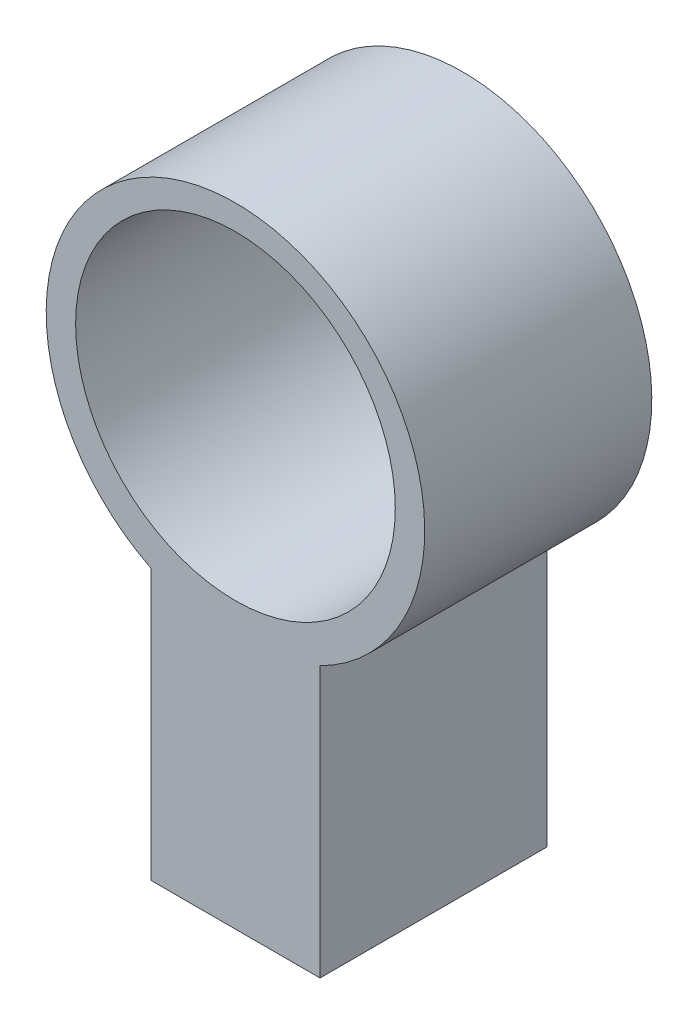
ISO-10303-21;
HEADER;
FILE_DESCRIPTION(('STEP AP214'),'2;1');
FILE_NAME('part.step','',(''),(''),'','','');
FILE_SCHEMA(('AUTOMOTIVE_DESIGN { 1 0 10303 214 1 1 1 1 }'));
ENDSEC;
DATA;
#1=APPLICATION_CONTEXT('core data for automotive mechanical design processes');
#2=APPLICATION_PROTOCOL_DEFINITION('international standard','automotive_design',2000,#1);
#3=PRODUCT_CONTEXT('',#1,'mechanical');
#4=PRODUCT('Part','Part','',(#3));
#5=PRODUCT_RELATED_PRODUCT_CATEGORY('part','',(#4));
#6=PRODUCT_DEFINITION_FORMATION('','',#4);
#7=PRODUCT_DEFINITION_CONTEXT('part definition',#1,'design');
#8=PRODUCT_DEFINITION('design','',#6,#7);
#9=PRODUCT_DEFINITION_SHAPE('','',#8);
#10=(LENGTH_UNIT() NAMED_UNIT(*) SI_UNIT(.MILLI.,.METRE.));
#11=(NAMED_UNIT(*) PLANE_ANGLE_UNIT() SI_UNIT($,.RADIAN.));
#12=(NAMED_UNIT(*) SI_UNIT($,.STERADIAN.) SOLID_ANGLE_UNIT());
#13=UNCERTAINTY_MEASURE_WITH_UNIT(LENGTH_MEASURE(1.E-05),#10,'distance_accuracy_value','');
#14=(GEOMETRIC_REPRESENTATION_CONTEXT(3) GLOBAL_UNCERTAINTY_ASSIGNED_CONTEXT((#13)) GLOBAL_UNIT_ASSIGNED_CONTEXT((#10,
#11,#12)) REPRESENTATION_CONTEXT('',''));
#15=CARTESIAN_POINT('',(0.,0.,0.));
#16=DIRECTION('',(0.,0.,1.));
#17=DIRECTION('',(1.,0.,0.));
#18=AXIS2_PLACEMENT_3D('',#15,#16,#17);
#19=CARTESIAN_POINT('',(0.,0.,18.));
#20=DIRECTION('',(0.,1.,0.));
#21=DIRECTION('',(0.,0.,1.));
#22=AXIS2_PLACEMENT_3D('',#19,#20,#21);
#23=PLANE('',#22);
#24=DIRECTION('',(1.,0.,0.));
#25=VECTOR('',#24,1.);
#26=CARTESIAN_POINT('',(0.,0.,0.));
#27=LINE('',#26,#25);
#28=CARTESIAN_POINT('',(0.,0.,0.));
#29=VERTEX_POINT('',#28);
#30=CARTESIAN_POINT('',(13.406115227976,0.,0.));
#31=VERTEX_POINT('',#30);
#32=EDGE_CURVE('E107',#29,#31,#27,.T.);
#33=ORIENTED_EDGE('',*,*,#32,.T.);
#34=DIRECTION('',(0.,0.,-1.));
#35=VECTOR('',#34,1.);
#36=CARTESIAN_POINT('',(13.406115227976,0.,18.));
#37=LINE('',#36,#35);
#38=CARTESIAN_POINT('',(13.406115227976,0.,18.));
#39=VERTEX_POINT('',#38);
#40=EDGE_CURVE('E11',#39,#31,#37,.T.);
#41=ORIENTED_EDGE('',*,*,#40,.F.);
#42=DIRECTION('',(1.,0.,0.));
#43=VECTOR('',#42,1.);
#44=CARTESIAN_POINT('',(0.,0.,18.));
#45=LINE('',#44,#43);
#46=CARTESIAN_POINT('',(0.,0.,18.));
#47=VERTEX_POINT('',#46);
#48=EDGE_CURVE('E91',#47,#39,#45,.T.);
#49=ORIENTED_EDGE('',*,*,#48,.F.);
#50=DIRECTION('',(0.,0.,-1.));
#51=VECTOR('',#50,1.);
#52=CARTESIAN_POINT('',(0.,0.,18.));
#53=LINE('',#52,#51);
#54=EDGE_CURVE('E103',#47,#29,#53,.T.);
#55=ORIENTED_EDGE('',*,*,#54,.T.);
#56=EDGE_LOOP('',(#33,#41,#49,#55));
#57=FACE_BOUND('',#56,.T.);
#58=ADVANCED_FACE('F39',(#57),#23,.F.);
#59=CARTESIAN_POINT('',(13.406115227976,0.,18.));
#60=DIRECTION('',(-1.,0.,0.));
#61=DIRECTION('',(0.,0.,1.));
#62=AXIS2_PLACEMENT_3D('',#59,#60,#61);
#63=PLANE('',#62);
#64=DIRECTION('',(0.,1.,0.));
#65=VECTOR('',#64,1.);
#66=CARTESIAN_POINT('',(13.406115227976,0.,0.));
#67=LINE('',#66,#65);
#68=CARTESIAN_POINT('',(13.406115227976,21.4353215798793,0.));
#69=VERTEX_POINT('',#68);
#70=EDGE_CURVE('E96',#31,#69,#67,.T.);
#71=ORIENTED_EDGE('',*,*,#70,.T.);
#72=DIRECTION('',(0.,0.,-1.));
#73=VECTOR('',#72,1.);
#74=CARTESIAN_POINT('',(13.406115227976,21.4353215798793,18.));
#75=LINE('',#74,#73);
#76=CARTESIAN_POINT('',(13.406115227976,21.4353215798793,18.));
#77=VERTEX_POINT('',#76);
#78=EDGE_CURVE('E48',#77,#69,#75,.T.);
#79=ORIENTED_EDGE('',*,*,#78,.F.);
#80=DIRECTION('',(0.,1.,0.));
#81=VECTOR('',#80,1.);
#82=CARTESIAN_POINT('',(13.406115227976,0.,18.));
#83=LINE('',#82,#81);
#84=EDGE_CURVE('E86',#39,#77,#83,.T.);
#85=ORIENTED_EDGE('',*,*,#84,.F.);
#86=ORIENTED_EDGE('',*,*,#40,.T.);
#87=EDGE_LOOP('',(#71,#79,#85,#86));
#88=FACE_BOUND('',#87,.T.);
#89=ADVANCED_FACE('F95',(#88),#63,.F.);
#90=CARTESIAN_POINT('',(6.70305761398802,34.8543013705921,18.));
#91=DIRECTION('',(0.,0.,-1.));
#92=DIRECTION('',(-1.,0.,0.));
#93=AXIS2_PLACEMENT_3D('',#90,#91,#92);
#94=CYLINDRICAL_SURFACE('',#93,15.);
#95=CARTESIAN_POINT('',(6.70305761398802,34.8543013705921,0.));
#96=DIRECTION('',(0.,0.,1.));
#97=DIRECTION('',(1.,0.,0.));
#98=AXIS2_PLACEMENT_3D('',#95,#96,#97);
#99=CIRCLE('',#98,15.);
#100=CARTESIAN_POINT('',(0.,21.4353215798793,0.));
#101=VERTEX_POINT('',#100);
#102=EDGE_CURVE('E73',#69,#101,#99,.T.);
#103=ORIENTED_EDGE('',*,*,#102,.T.);
#104=DIRECTION('',(0.,0.,-1.));
#105=VECTOR('',#104,1.);
#106=CARTESIAN_POINT('',(0.,21.4353215798793,18.));
#107=LINE('',#106,#105);
#108=CARTESIAN_POINT('',(0.,21.4353215798793,18.));
#109=VERTEX_POINT('',#108);
#110=EDGE_CURVE('E98',#109,#101,#107,.T.);
#111=ORIENTED_EDGE('',*,*,#110,.F.);
#112=CARTESIAN_POINT('',(6.70305761398802,34.8543013705921,18.));
#113=DIRECTION('',(0.,0.,1.));
#114=DIRECTION('',(1.,0.,0.));
#115=AXIS2_PLACEMENT_3D('',#112,#113,#114);
#116=CIRCLE('',#115,15.);
#117=EDGE_CURVE('E89',#77,#109,#116,.T.);
#118=ORIENTED_EDGE('',*,*,#117,.F.);
#119=ORIENTED_EDGE('',*,*,#78,.T.);
#120=EDGE_LOOP('',(#103,#111,#118,#119));
#121=FACE_BOUND('',#120,.T.);
#122=ADVANCED_FACE('F99',(#121),#94,.T.);
#123=CARTESIAN_POINT('',(0.,0.,18.));
#124=DIRECTION('',(1.,0.,0.));
#125=DIRECTION('',(0.,0.,-1.));
#126=AXIS2_PLACEMENT_3D('',#123,#124,#125);
#127=PLANE('',#126);
#128=DIRECTION('',(0.,-1.,0.));
#129=VECTOR('',#128,1.);
#130=CARTESIAN_POINT('',(0.,0.,0.));
#131=LINE('',#130,#129);
#132=EDGE_CURVE('E79',#101,#29,#131,.T.);
#133=ORIENTED_EDGE('',*,*,#132,.T.);
#134=ORIENTED_EDGE('',*,*,#54,.F.);
#135=DIRECTION('',(0.,-1.,0.));
#136=VECTOR('',#135,1.);
#137=CARTESIAN_POINT('',(0.,0.,18.));
#138=LINE('',#137,#136);
#139=EDGE_CURVE('E56',#109,#47,#138,.T.);
#140=ORIENTED_EDGE('',*,*,#139,.F.);
#141=ORIENTED_EDGE('',*,*,#110,.T.);
#142=EDGE_LOOP('',(#133,#134,#140,#141));
#143=FACE_BOUND('',#142,.T.);
#144=ADVANCED_FACE('F121',(#143),#127,.F.);
#145=CARTESIAN_POINT('',(6.70305761398802,34.8543013705921,18.));
#146=DIRECTION('',(0.,0.,1.));
#147=DIRECTION('',(1.,0.,0.));
#148=AXIS2_PLACEMENT_3D('',#145,#146,#147);
#149=PLANE('',#148);
#150=CARTESIAN_POINT('',(6.70305761398802,35.2100844053008,18.));
#151=DIRECTION('',(0.,0.,1.));
#152=DIRECTION('',(1.,0.,0.));
#153=AXIS2_PLACEMENT_3D('',#150,#151,#152);
#154=CIRCLE('',#153,12.6680255649027);
#155=CARTESIAN_POINT('',(19.3710831788907,35.2100844053008,18.));
#156=VERTEX_POINT('',#155);
#157=EDGE_CURVE('E128',#156,#156,#154,.T.);
#158=ORIENTED_EDGE('',*,*,#157,.F.);
#159=EDGE_LOOP('',(#158));
#160=FACE_BOUND('',#159,.T.);
#161=ORIENTED_EDGE('',*,*,#48,.T.);
#162=ORIENTED_EDGE('',*,*,#84,.T.);
#163=ORIENTED_EDGE('',*,*,#117,.T.);
#164=ORIENTED_EDGE('',*,*,#139,.T.);
#165=EDGE_LOOP('',(#161,#162,#163,#164));
#166=FACE_BOUND('',#165,.T.);
#167=ADVANCED_FACE('F87',(#160,#166),#149,.T.);
#168=CARTESIAN_POINT('',(6.70305761398802,34.8543013705921,0.));
#169=DIRECTION('',(0.,0.,1.));
#170=DIRECTION('',(1.,0.,0.));
#171=AXIS2_PLACEMENT_3D('',#168,#169,#170);
#172=PLANE('',#171);
#173=CARTESIAN_POINT('',(6.70305761398802,35.2100844053008,0.));
#174=DIRECTION('',(0.,0.,1.));
#175=DIRECTION('',(1.,0.,0.));
#176=AXIS2_PLACEMENT_3D('',#173,#174,#175);
#177=CIRCLE('',#176,12.6680255649027);
#178=CARTESIAN_POINT('',(19.3710831788907,35.2100844053008,0.));
#179=VERTEX_POINT('',#178);
#180=EDGE_CURVE('E111',#179,#179,#177,.T.);
#181=ORIENTED_EDGE('',*,*,#180,.T.);
#182=EDGE_LOOP('',(#181));
#183=FACE_BOUND('',#182,.T.);
#184=ORIENTED_EDGE('',*,*,#32,.F.);
#185=ORIENTED_EDGE('',*,*,#132,.F.);
#186=ORIENTED_EDGE('',*,*,#102,.F.);
#187=ORIENTED_EDGE('',*,*,#70,.F.);
#188=EDGE_LOOP('',(#184,#185,#186,#187));
#189=FACE_BOUND('',#188,.T.);
#190=ADVANCED_FACE('F124',(#183,#189),#172,.F.);
#191=CARTESIAN_POINT('',(6.70305761398802,35.2100844053008,0.));
#192=DIRECTION('',(0.,0.,1.));
#193=DIRECTION('',(1.,0.,0.));
#194=AXIS2_PLACEMENT_3D('',#191,#192,#193);
#195=CYLINDRICAL_SURFACE('',#194,12.6680255649027);
#196=ORIENTED_EDGE('',*,*,#180,.F.);
#197=EDGE_LOOP('',(#196));
#198=FACE_BOUND('',#197,.T.);
#199=ORIENTED_EDGE('',*,*,#157,.T.);
#200=EDGE_LOOP('',(#199));
#201=FACE_BOUND('',#200,.T.);
#202=ADVANCED_FACE('F137',(#198,#201),#195,.F.);
#203=CLOSED_SHELL('',(#58,#89,#122,#144,#167,#190,#202));
#204=MANIFOLD_SOLID_BREP('B2',#203);
#205=ADVANCED_BREP_SHAPE_REPRESENTATION('',(#18,#204),#14);
#206=SHAPE_DEFINITION_REPRESENTATION(#9,#205);
ENDSEC;
END-ISO-10303-21;
